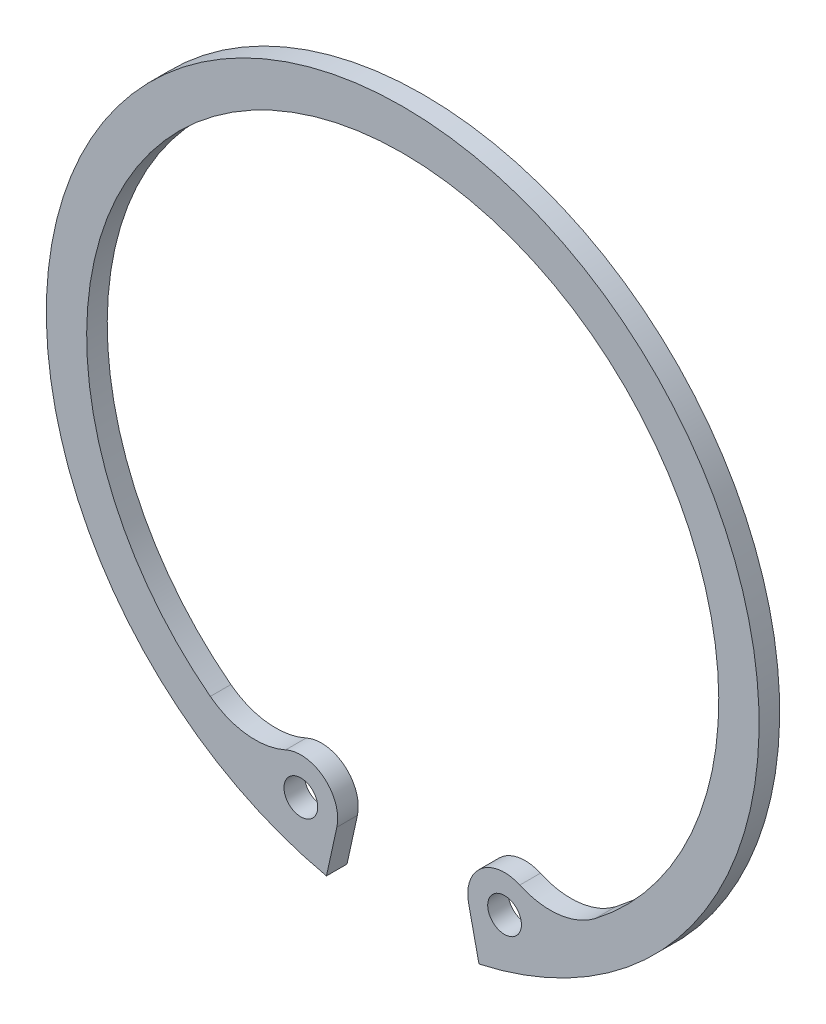
ISO-10303-21;
HEADER;
FILE_DESCRIPTION(('STEP AP214'),'2;1');
FILE_NAME('part.step','',(''),(''),'','','');
FILE_SCHEMA(('AUTOMOTIVE_DESIGN { 1 0 10303 214 1 1 1 1 }'));
ENDSEC;
DATA;
#1=APPLICATION_CONTEXT('core data for automotive mechanical design processes');
#2=APPLICATION_PROTOCOL_DEFINITION('international standard','automotive_design',2000,#1);
#3=PRODUCT_CONTEXT('',#1,'mechanical');
#4=PRODUCT('Part','Part','',(#3));
#5=PRODUCT_RELATED_PRODUCT_CATEGORY('part','',(#4));
#6=PRODUCT_DEFINITION_FORMATION('','',#4);
#7=PRODUCT_DEFINITION_CONTEXT('part definition',#1,'design');
#8=PRODUCT_DEFINITION('design','',#6,#7);
#9=PRODUCT_DEFINITION_SHAPE('','',#8);
#10=(LENGTH_UNIT() NAMED_UNIT(*) SI_UNIT(.MILLI.,.METRE.));
#11=(NAMED_UNIT(*) PLANE_ANGLE_UNIT() SI_UNIT($,.RADIAN.));
#12=(NAMED_UNIT(*) SI_UNIT($,.STERADIAN.) SOLID_ANGLE_UNIT());
#13=UNCERTAINTY_MEASURE_WITH_UNIT(LENGTH_MEASURE(1.E-05),#10,'distance_accuracy_value','');
#14=(GEOMETRIC_REPRESENTATION_CONTEXT(3) GLOBAL_UNCERTAINTY_ASSIGNED_CONTEXT((#13)) GLOBAL_UNIT_ASSIGNED_CONTEXT((#10,
#11,#12)) REPRESENTATION_CONTEXT('',''));
#15=CARTESIAN_POINT('',(0.,0.,0.));
#16=DIRECTION('',(0.,0.,1.));
#17=DIRECTION('',(1.,0.,0.));
#18=AXIS2_PLACEMENT_3D('',#15,#16,#17);
#19=CARTESIAN_POINT('',(0.,0.,-0.635));
#20=DIRECTION('',(0.,0.,1.));
#21=DIRECTION('',(1.,0.,0.));
#22=AXIS2_PLACEMENT_3D('',#19,#20,#21);
#23=CYLINDRICAL_SURFACE('',#22,11.);
#24=CARTESIAN_POINT('',(0.,0.,0.));
#25=DIRECTION('',(0.,0.,1.));
#26=DIRECTION('',(1.,0.,0.));
#27=AXIS2_PLACEMENT_3D('',#24,#25,#26);
#28=CIRCLE('',#27,11.);
#29=CARTESIAN_POINT('',(2.35358757882437,-10.7452606068352,0.));
#30=VERTEX_POINT('',#29);
#31=CARTESIAN_POINT('',(-2.35358757882437,-10.7452606068352,0.));
#32=VERTEX_POINT('',#31);
#33=EDGE_CURVE('E130',#30,#32,#28,.T.);
#34=ORIENTED_EDGE('',*,*,#33,.F.);
#35=DIRECTION('',(0.,0.,1.));
#36=VECTOR('',#35,1.);
#37=CARTESIAN_POINT('',(2.35358757882437,-10.7452606068352,-0.635));
#38=LINE('',#37,#36);
#39=CARTESIAN_POINT('',(2.35358757882437,-10.7452606068352,-0.635));
#40=VERTEX_POINT('',#39);
#41=EDGE_CURVE('E11',#40,#30,#38,.T.);
#42=ORIENTED_EDGE('',*,*,#41,.F.);
#43=CARTESIAN_POINT('',(0.,0.,-0.635));
#44=DIRECTION('',(0.,0.,1.));
#45=DIRECTION('',(1.,0.,0.));
#46=AXIS2_PLACEMENT_3D('',#43,#44,#45);
#47=CIRCLE('',#46,11.);
#48=CARTESIAN_POINT('',(-2.35358757882437,-10.7452606068352,-0.635));
#49=VERTEX_POINT('',#48);
#50=EDGE_CURVE('E151',#40,#49,#47,.T.);
#51=ORIENTED_EDGE('',*,*,#50,.T.);
#52=DIRECTION('',(0.,0.,1.));
#53=VECTOR('',#52,1.);
#54=CARTESIAN_POINT('',(-2.35358757882437,-10.7452606068352,-0.635));
#55=LINE('',#54,#53);
#56=EDGE_CURVE('E36',#49,#32,#55,.T.);
#57=ORIENTED_EDGE('',*,*,#56,.T.);
#58=EDGE_LOOP('',(#34,#42,#51,#57));
#59=FACE_BOUND('',#58,.T.);
#60=ADVANCED_FACE('F33',(#59),#23,.T.);
#61=CARTESIAN_POINT('',(2.35358757882437,-10.7452606068352,-0.635));
#62=DIRECTION('',(-0.976841873348651,-0.213962507165852,0.));
#63=DIRECTION('',(0.213962507165852,-0.976841873348651,0.));
#64=AXIS2_PLACEMENT_3D('',#61,#62,#63);
#65=PLANE('',#64);
#66=DIRECTION('',(0.213962507165852,-0.976841873348651,0.));
#67=VECTOR('',#66,1.);
#68=CARTESIAN_POINT('',(2.35358757882437,-10.7452606068352,0.));
#69=LINE('',#68,#67);
#70=CARTESIAN_POINT('',(2.03339652650988,-9.28343427326212,0.));
#71=VERTEX_POINT('',#70);
#72=EDGE_CURVE('E149',#71,#30,#69,.T.);
#73=ORIENTED_EDGE('',*,*,#72,.F.);
#74=DIRECTION('',(0.,0.,1.));
#75=VECTOR('',#74,1.);
#76=CARTESIAN_POINT('',(2.03339652650988,-9.28343427326212,-0.635));
#77=LINE('',#76,#75);
#78=CARTESIAN_POINT('',(2.03339652650988,-9.28343427326212,-0.635));
#79=VERTEX_POINT('',#78);
#80=EDGE_CURVE('E42',#79,#71,#77,.T.);
#81=ORIENTED_EDGE('',*,*,#80,.F.);
#82=DIRECTION('',(0.213962507165852,-0.976841873348651,0.));
#83=VECTOR('',#82,1.);
#84=CARTESIAN_POINT('',(2.35358757882437,-10.7452606068352,-0.635));
#85=LINE('',#84,#83);
#86=EDGE_CURVE('E120',#79,#40,#85,.T.);
#87=ORIENTED_EDGE('',*,*,#86,.T.);
#88=ORIENTED_EDGE('',*,*,#41,.T.);
#89=EDGE_LOOP('',(#73,#81,#87,#88));
#90=FACE_BOUND('',#89,.T.);
#91=ADVANCED_FACE('F163',(#90),#65,.T.);
#92=CARTESIAN_POINT('',(3.14372384185163,-9.04023378949205,-0.635));
#93=DIRECTION('',(0.,0.,1.));
#94=DIRECTION('',(1.,0.,0.));
#95=AXIS2_PLACEMENT_3D('',#92,#93,#94);
#96=CYLINDRICAL_SURFACE('',#95,1.13665);
#97=CARTESIAN_POINT('',(3.14372384185163,-9.04023378949205,0.));
#98=DIRECTION('',(0.,0.,1.));
#99=DIRECTION('',(1.,0.,0.));
#100=AXIS2_PLACEMENT_3D('',#97,#98,#99);
#101=CIRCLE('',#100,1.13665);
#102=CARTESIAN_POINT('',(3.61408719056314,-8.00547220212571,0.));
#103=VERTEX_POINT('',#102);
#104=EDGE_CURVE('E107',#103,#71,#101,.T.);
#105=ORIENTED_EDGE('',*,*,#104,.F.);
#106=DIRECTION('',(0.,0.,1.));
#107=VECTOR('',#106,1.);
#108=CARTESIAN_POINT('',(3.61408719056314,-8.00547220212571,-0.635));
#109=LINE('',#108,#107);
#110=CARTESIAN_POINT('',(3.61408719056314,-8.00547220212571,-0.635));
#111=VERTEX_POINT('',#110);
#112=EDGE_CURVE('E102',#111,#103,#109,.T.);
#113=ORIENTED_EDGE('',*,*,#112,.F.);
#114=CARTESIAN_POINT('',(3.14372384185163,-9.04023378949205,-0.635));
#115=DIRECTION('',(0.,0.,1.));
#116=DIRECTION('',(1.,0.,0.));
#117=AXIS2_PLACEMENT_3D('',#114,#115,#116);
#118=CIRCLE('',#117,1.13665);
#119=EDGE_CURVE('E105',#111,#79,#118,.T.);
#120=ORIENTED_EDGE('',*,*,#119,.T.);
#121=ORIENTED_EDGE('',*,*,#80,.T.);
#122=EDGE_LOOP('',(#105,#113,#120,#121));
#123=FACE_BOUND('',#122,.T.);
#124=ADVANCED_FACE('F104',(#123),#96,.T.);
#125=CARTESIAN_POINT('',(4.55481388798615,-5.93594902739305,-0.635));
#126=DIRECTION('',(0.,0.,1.));
#127=DIRECTION('',(1.,0.,0.));
#128=AXIS2_PLACEMENT_3D('',#125,#126,#127);
#129=CYLINDRICAL_SURFACE('',#128,2.2733);
#130=CARTESIAN_POINT('',(4.55481388798615,-5.93594902739305,0.));
#131=DIRECTION('',(0.,0.,-1.));
#132=DIRECTION('',(1.,0.,0.));
#133=AXIS2_PLACEMENT_3D('',#130,#131,#132);
#134=CIRCLE('',#133,2.2733);
#135=CARTESIAN_POINT('',(5.93871124455168,-7.73947917587711,0.));
#136=VERTEX_POINT('',#135);
#137=EDGE_CURVE('E146',#136,#103,#134,.T.);
#138=ORIENTED_EDGE('',*,*,#137,.F.);
#139=DIRECTION('',(0.,0.,1.));
#140=VECTOR('',#139,1.);
#141=CARTESIAN_POINT('',(5.93871124455168,-7.73947917587711,-0.635));
#142=LINE('',#141,#140);
#143=CARTESIAN_POINT('',(5.93871124455168,-7.73947917587711,-0.635));
#144=VERTEX_POINT('',#143);
#145=EDGE_CURVE('E112',#144,#136,#142,.T.);
#146=ORIENTED_EDGE('',*,*,#145,.F.);
#147=CARTESIAN_POINT('',(4.55481388798615,-5.93594902739305,-0.635));
#148=DIRECTION('',(0.,0.,-1.));
#149=DIRECTION('',(1.,0.,0.));
#150=AXIS2_PLACEMENT_3D('',#147,#148,#149);
#151=CIRCLE('',#150,2.2733);
#152=EDGE_CURVE('E118',#144,#111,#151,.T.);
#153=ORIENTED_EDGE('',*,*,#152,.T.);
#154=ORIENTED_EDGE('',*,*,#112,.T.);
#155=EDGE_LOOP('',(#138,#146,#153,#154));
#156=FACE_BOUND('',#155,.T.);
#157=ADVANCED_FACE('F122',(#156),#129,.F.);
#158=CARTESIAN_POINT('',(0.,0.,-0.635));
#159=DIRECTION('',(0.,0.,1.));
#160=DIRECTION('',(1.,0.,0.));
#161=AXIS2_PLACEMENT_3D('',#158,#159,#160);
#162=CYLINDRICAL_SURFACE('',#161,9.75539999999999);
#163=CARTESIAN_POINT('',(0.,0.,0.));
#164=DIRECTION('',(0.,0.,-1.));
#165=DIRECTION('',(1.,0.,0.));
#166=AXIS2_PLACEMENT_3D('',#163,#164,#165);
#167=CIRCLE('',#166,9.75539999999999);
#168=CARTESIAN_POINT('',(-5.93871124455168,-7.73947917587711,0.));
#169=VERTEX_POINT('',#168);
#170=EDGE_CURVE('E143',#169,#136,#167,.T.);
#171=ORIENTED_EDGE('',*,*,#170,.F.);
#172=DIRECTION('',(0.,0.,1.));
#173=VECTOR('',#172,1.);
#174=CARTESIAN_POINT('',(-5.93871124455168,-7.73947917587711,-0.635));
#175=LINE('',#174,#173);
#176=CARTESIAN_POINT('',(-5.93871124455168,-7.73947917587711,-0.635));
#177=VERTEX_POINT('',#176);
#178=EDGE_CURVE('E155',#177,#169,#175,.T.);
#179=ORIENTED_EDGE('',*,*,#178,.F.);
#180=CARTESIAN_POINT('',(0.,0.,-0.635));
#181=DIRECTION('',(0.,0.,-1.));
#182=DIRECTION('',(1.,0.,0.));
#183=AXIS2_PLACEMENT_3D('',#180,#181,#182);
#184=CIRCLE('',#183,9.75539999999999);
#185=EDGE_CURVE('E123',#177,#144,#184,.T.);
#186=ORIENTED_EDGE('',*,*,#185,.T.);
#187=ORIENTED_EDGE('',*,*,#145,.T.);
#188=EDGE_LOOP('',(#171,#179,#186,#187));
#189=FACE_BOUND('',#188,.T.);
#190=ADVANCED_FACE('F176',(#189),#162,.F.);
#191=CARTESIAN_POINT('',(-4.55481388798615,-5.93594902739305,-0.635));
#192=DIRECTION('',(0.,0.,1.));
#193=DIRECTION('',(1.,0.,0.));
#194=AXIS2_PLACEMENT_3D('',#191,#192,#193);
#195=CYLINDRICAL_SURFACE('',#194,2.2733);
#196=CARTESIAN_POINT('',(-4.55481388798615,-5.93594902739305,0.));
#197=DIRECTION('',(0.,0.,-1.));
#198=DIRECTION('',(1.,0.,0.));
#199=AXIS2_PLACEMENT_3D('',#196,#197,#198);
#200=CIRCLE('',#199,2.2733);
#201=CARTESIAN_POINT('',(-3.61408719056314,-8.00547220212572,0.));
#202=VERTEX_POINT('',#201);
#203=EDGE_CURVE('E140',#202,#169,#200,.T.);
#204=ORIENTED_EDGE('',*,*,#203,.F.);
#205=DIRECTION('',(0.,0.,1.));
#206=VECTOR('',#205,1.);
#207=CARTESIAN_POINT('',(-3.61408719056314,-8.00547220212572,-0.635));
#208=LINE('',#207,#206);
#209=CARTESIAN_POINT('',(-3.61408719056314,-8.00547220212572,-0.635));
#210=VERTEX_POINT('',#209);
#211=EDGE_CURVE('E157',#210,#202,#208,.T.);
#212=ORIENTED_EDGE('',*,*,#211,.F.);
#213=CARTESIAN_POINT('',(-4.55481388798615,-5.93594902739305,-0.635));
#214=DIRECTION('',(0.,0.,-1.));
#215=DIRECTION('',(1.,0.,0.));
#216=AXIS2_PLACEMENT_3D('',#213,#214,#215);
#217=CIRCLE('',#216,2.2733);
#218=EDGE_CURVE('E125',#210,#177,#217,.T.);
#219=ORIENTED_EDGE('',*,*,#218,.T.);
#220=ORIENTED_EDGE('',*,*,#178,.T.);
#221=EDGE_LOOP('',(#204,#212,#219,#220));
#222=FACE_BOUND('',#221,.T.);
#223=ADVANCED_FACE('F179',(#222),#195,.F.);
#224=CARTESIAN_POINT('',(-3.14372384185163,-9.04023378949205,-0.635));
#225=DIRECTION('',(0.,0.,1.));
#226=DIRECTION('',(1.,0.,0.));
#227=AXIS2_PLACEMENT_3D('',#224,#225,#226);
#228=CYLINDRICAL_SURFACE('',#227,1.13665);
#229=CARTESIAN_POINT('',(-3.14372384185163,-9.04023378949205,0.));
#230=DIRECTION('',(0.,0.,1.));
#231=DIRECTION('',(1.,0.,0.));
#232=AXIS2_PLACEMENT_3D('',#229,#230,#231);
#233=CIRCLE('',#232,1.13665);
#234=CARTESIAN_POINT('',(-2.03339652650988,-9.28343427326212,0.));
#235=VERTEX_POINT('',#234);
#236=EDGE_CURVE('E137',#235,#202,#233,.T.);
#237=ORIENTED_EDGE('',*,*,#236,.F.);
#238=DIRECTION('',(0.,0.,1.));
#239=VECTOR('',#238,1.);
#240=CARTESIAN_POINT('',(-2.03339652650988,-9.28343427326212,-0.635));
#241=LINE('',#240,#239);
#242=CARTESIAN_POINT('',(-2.03339652650988,-9.28343427326212,-0.635));
#243=VERTEX_POINT('',#242);
#244=EDGE_CURVE('E158',#243,#235,#241,.T.);
#245=ORIENTED_EDGE('',*,*,#244,.F.);
#246=CARTESIAN_POINT('',(-3.14372384185163,-9.04023378949205,-0.635));
#247=DIRECTION('',(0.,0.,1.));
#248=DIRECTION('',(1.,0.,0.));
#249=AXIS2_PLACEMENT_3D('',#246,#247,#248);
#250=CIRCLE('',#249,1.13665);
#251=EDGE_CURVE('E225',#243,#210,#250,.T.);
#252=ORIENTED_EDGE('',*,*,#251,.T.);
#253=ORIENTED_EDGE('',*,*,#211,.T.);
#254=EDGE_LOOP('',(#237,#245,#252,#253));
#255=FACE_BOUND('',#254,.T.);
#256=ADVANCED_FACE('F183',(#255),#228,.T.);
#257=CARTESIAN_POINT('',(-2.35358757882437,-10.7452606068352,-0.635));
#258=DIRECTION('',(0.976841873348651,-0.213962507165852,0.));
#259=DIRECTION('',(0.213962507165852,0.976841873348651,0.));
#260=AXIS2_PLACEMENT_3D('',#257,#258,#259);
#261=PLANE('',#260);
#262=DIRECTION('',(0.213962507165852,0.976841873348651,0.));
#263=VECTOR('',#262,1.);
#264=CARTESIAN_POINT('',(-2.35358757882437,-10.7452606068352,0.));
#265=LINE('',#264,#263);
#266=EDGE_CURVE('E133',#32,#235,#265,.T.);
#267=ORIENTED_EDGE('',*,*,#266,.F.);
#268=ORIENTED_EDGE('',*,*,#56,.F.);
#269=DIRECTION('',(0.213962507165852,0.976841873348651,0.));
#270=VECTOR('',#269,1.);
#271=CARTESIAN_POINT('',(-2.35358757882437,-10.7452606068352,-0.635));
#272=LINE('',#271,#270);
#273=EDGE_CURVE('E223',#49,#243,#272,.T.);
#274=ORIENTED_EDGE('',*,*,#273,.T.);
#275=ORIENTED_EDGE('',*,*,#244,.T.);
#276=EDGE_LOOP('',(#267,#268,#274,#275));
#277=FACE_BOUND('',#276,.T.);
#278=ADVANCED_FACE('F160',(#277),#261,.T.);
#279=CARTESIAN_POINT('',(0.,0.,-0.635));
#280=DIRECTION('',(0.,0.,1.));
#281=DIRECTION('',(1.,0.,0.));
#282=AXIS2_PLACEMENT_3D('',#279,#280,#281);
#283=PLANE('',#282);
#284=CARTESIAN_POINT('',(-3.14372384185163,-9.04023378949205,-0.635));
#285=DIRECTION('',(0.,0.,1.));
#286=DIRECTION('',(1.,0.,0.));
#287=AXIS2_PLACEMENT_3D('',#284,#285,#286);
#288=CIRCLE('',#287,0.5207);
#289=CARTESIAN_POINT('',(-2.62302384185163,-9.04023378949205,-0.635));
#290=VERTEX_POINT('',#289);
#291=EDGE_CURVE('E210',#290,#290,#288,.T.);
#292=ORIENTED_EDGE('',*,*,#291,.T.);
#293=EDGE_LOOP('',(#292));
#294=FACE_BOUND('',#293,.T.);
#295=CARTESIAN_POINT('',(3.14372384185163,-9.04023378949205,-0.635));
#296=DIRECTION('',(0.,0.,1.));
#297=DIRECTION('',(1.,0.,0.));
#298=AXIS2_PLACEMENT_3D('',#295,#296,#297);
#299=CIRCLE('',#298,0.5207);
#300=CARTESIAN_POINT('',(3.66442384185163,-9.04023378949205,-0.635));
#301=VERTEX_POINT('',#300);
#302=EDGE_CURVE('E134',#301,#301,#299,.T.);
#303=ORIENTED_EDGE('',*,*,#302,.T.);
#304=EDGE_LOOP('',(#303));
#305=FACE_BOUND('',#304,.T.);
#306=ORIENTED_EDGE('',*,*,#50,.F.);
#307=ORIENTED_EDGE('',*,*,#86,.F.);
#308=ORIENTED_EDGE('',*,*,#119,.F.);
#309=ORIENTED_EDGE('',*,*,#152,.F.);
#310=ORIENTED_EDGE('',*,*,#185,.F.);
#311=ORIENTED_EDGE('',*,*,#218,.F.);
#312=ORIENTED_EDGE('',*,*,#251,.F.);
#313=ORIENTED_EDGE('',*,*,#273,.F.);
#314=EDGE_LOOP('',(#306,#307,#308,#309,#310,#311,#312,#313));
#315=FACE_BOUND('',#314,.T.);
#316=ADVANCED_FACE('F116',(#294,#305,#315),#283,.F.);
#317=CARTESIAN_POINT('',(0.,0.,0.));
#318=DIRECTION('',(0.,0.,1.));
#319=DIRECTION('',(1.,0.,0.));
#320=AXIS2_PLACEMENT_3D('',#317,#318,#319);
#321=PLANE('',#320);
#322=CARTESIAN_POINT('',(-3.14372384185163,-9.04023378949205,0.));
#323=DIRECTION('',(0.,0.,1.));
#324=DIRECTION('',(1.,0.,0.));
#325=AXIS2_PLACEMENT_3D('',#322,#323,#324);
#326=CIRCLE('',#325,0.5207);
#327=CARTESIAN_POINT('',(-2.62302384185163,-9.04023378949205,0.));
#328=VERTEX_POINT('',#327);
#329=EDGE_CURVE('E213',#328,#328,#326,.T.);
#330=ORIENTED_EDGE('',*,*,#329,.F.);
#331=EDGE_LOOP('',(#330));
#332=FACE_BOUND('',#331,.T.);
#333=CARTESIAN_POINT('',(3.14372384185163,-9.04023378949205,0.));
#334=DIRECTION('',(0.,0.,1.));
#335=DIRECTION('',(1.,0.,0.));
#336=AXIS2_PLACEMENT_3D('',#333,#334,#335);
#337=CIRCLE('',#336,0.5207);
#338=CARTESIAN_POINT('',(3.66442384185163,-9.04023378949205,0.));
#339=VERTEX_POINT('',#338);
#340=EDGE_CURVE('E215',#339,#339,#337,.T.);
#341=ORIENTED_EDGE('',*,*,#340,.F.);
#342=EDGE_LOOP('',(#341));
#343=FACE_BOUND('',#342,.T.);
#344=ORIENTED_EDGE('',*,*,#33,.T.);
#345=ORIENTED_EDGE('',*,*,#266,.T.);
#346=ORIENTED_EDGE('',*,*,#236,.T.);
#347=ORIENTED_EDGE('',*,*,#203,.T.);
#348=ORIENTED_EDGE('',*,*,#170,.T.);
#349=ORIENTED_EDGE('',*,*,#137,.T.);
#350=ORIENTED_EDGE('',*,*,#104,.T.);
#351=ORIENTED_EDGE('',*,*,#72,.T.);
#352=EDGE_LOOP('',(#344,#345,#346,#347,#348,#349,#350,#351));
#353=FACE_BOUND('',#352,.T.);
#354=ADVANCED_FACE('F162',(#332,#343,#353),#321,.T.);
#355=CARTESIAN_POINT('',(3.14372384185163,-9.04023378949205,-0.635));
#356=DIRECTION('',(0.,0.,1.));
#357=DIRECTION('',(1.,0.,0.));
#358=AXIS2_PLACEMENT_3D('',#355,#356,#357);
#359=CYLINDRICAL_SURFACE('',#358,0.5207);
#360=ORIENTED_EDGE('',*,*,#302,.F.);
#361=EDGE_LOOP('',(#360));
#362=FACE_BOUND('',#361,.T.);
#363=ORIENTED_EDGE('',*,*,#340,.T.);
#364=EDGE_LOOP('',(#363));
#365=FACE_BOUND('',#364,.T.);
#366=ADVANCED_FACE('F195',(#362,#365),#359,.F.);
#367=CARTESIAN_POINT('',(-3.14372384185163,-9.04023378949205,-0.635));
#368=DIRECTION('',(0.,0.,1.));
#369=DIRECTION('',(1.,0.,0.));
#370=AXIS2_PLACEMENT_3D('',#367,#368,#369);
#371=CYLINDRICAL_SURFACE('',#370,0.5207);
#372=ORIENTED_EDGE('',*,*,#291,.F.);
#373=EDGE_LOOP('',(#372));
#374=FACE_BOUND('',#373,.T.);
#375=ORIENTED_EDGE('',*,*,#329,.T.);
#376=EDGE_LOOP('',(#375));
#377=FACE_BOUND('',#376,.T.);
#378=ADVANCED_FACE('F202',(#374,#377),#371,.F.);
#379=CLOSED_SHELL('',(#60,#91,#124,#157,#190,#223,#256,#278,#316,#354,#366,#378));
#380=MANIFOLD_SOLID_BREP('B2',#379);
#381=ADVANCED_BREP_SHAPE_REPRESENTATION('',(#18,#380),#14);
#382=SHAPE_DEFINITION_REPRESENTATION(#9,#381);
ENDSEC;
END-ISO-10303-21;
